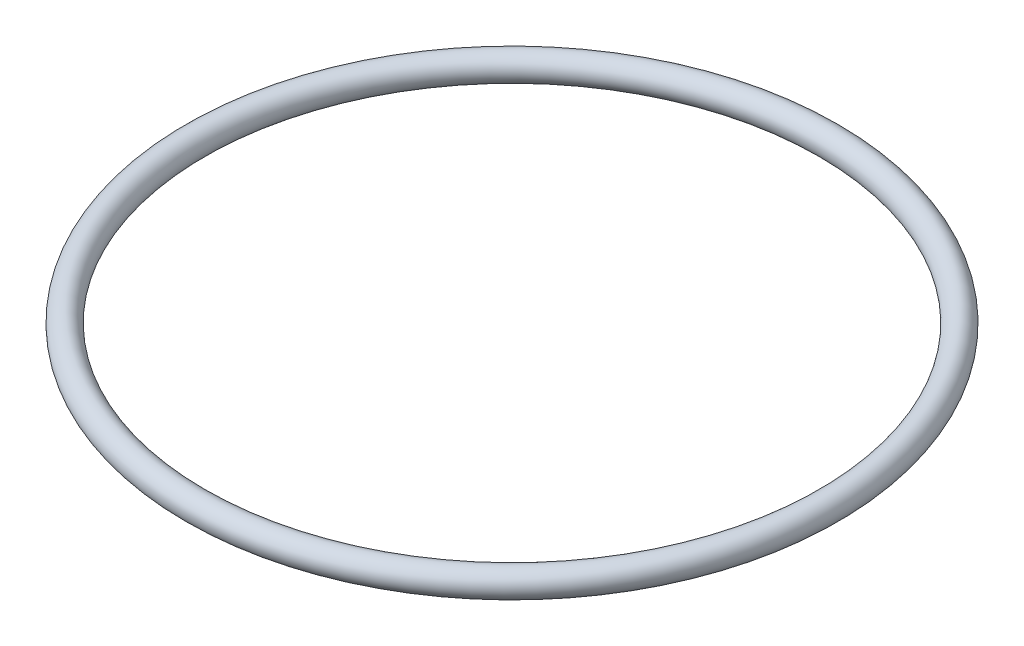
ISO-10303-21;
HEADER;
FILE_DESCRIPTION(('STEP AP214'),'2;1');
FILE_NAME('part.step','',(''),(''),'','','');
FILE_SCHEMA(('AUTOMOTIVE_DESIGN { 1 0 10303 214 1 1 1 1 }'));
ENDSEC;
DATA;
#1=APPLICATION_CONTEXT('core data for automotive mechanical design processes');
#2=APPLICATION_PROTOCOL_DEFINITION('international standard','automotive_design',2000,#1);
#3=PRODUCT_CONTEXT('',#1,'mechanical');
#4=PRODUCT('Part','Part','',(#3));
#5=PRODUCT_RELATED_PRODUCT_CATEGORY('part','',(#4));
#6=PRODUCT_DEFINITION_FORMATION('','',#4);
#7=PRODUCT_DEFINITION_CONTEXT('part definition',#1,'design');
#8=PRODUCT_DEFINITION('design','',#6,#7);
#9=PRODUCT_DEFINITION_SHAPE('','',#8);
#10=(LENGTH_UNIT() NAMED_UNIT(*) SI_UNIT(.MILLI.,.METRE.));
#11=(NAMED_UNIT(*) PLANE_ANGLE_UNIT() SI_UNIT($,.RADIAN.));
#12=(NAMED_UNIT(*) SI_UNIT($,.STERADIAN.) SOLID_ANGLE_UNIT());
#13=UNCERTAINTY_MEASURE_WITH_UNIT(LENGTH_MEASURE(1.E-05),#10,'distance_accuracy_value','');
#14=(GEOMETRIC_REPRESENTATION_CONTEXT(3) GLOBAL_UNCERTAINTY_ASSIGNED_CONTEXT((#13)) GLOBAL_UNIT_ASSIGNED_CONTEXT((#10,
#11,#12)) REPRESENTATION_CONTEXT('',''));
#15=CARTESIAN_POINT('',(0.,0.,0.));
#16=DIRECTION('',(0.,0.,1.));
#17=DIRECTION('',(1.,0.,0.));
#18=AXIS2_PLACEMENT_3D('',#15,#16,#17);
#19=CARTESIAN_POINT('',(0.,0.,0.));
#20=DIRECTION('',(0.,-1.,0.));
#21=DIRECTION('',(0.,0.,-1.));
#22=AXIS2_PLACEMENT_3D('',#19,#20,#21);
#23=TOROIDAL_SURFACE('',#22,12.,0.500000000000001);
#24=CARTESIAN_POINT('',(0.,0.,-12.5));
#25=VERTEX_POINT('',#24);
#26=VERTEX_LOOP('',#25);
#27=FACE_BOUND('',#26,.T.);
#28=ADVANCED_FACE('F33',(#27),#23,.T.);
#29=CLOSED_SHELL('',(#28));
#30=MANIFOLD_SOLID_BREP('B2',#29);
#31=ADVANCED_BREP_SHAPE_REPRESENTATION('',(#18,#30),#14);
#32=SHAPE_DEFINITION_REPRESENTATION(#9,#31);
ENDSEC;
END-ISO-10303-21;
